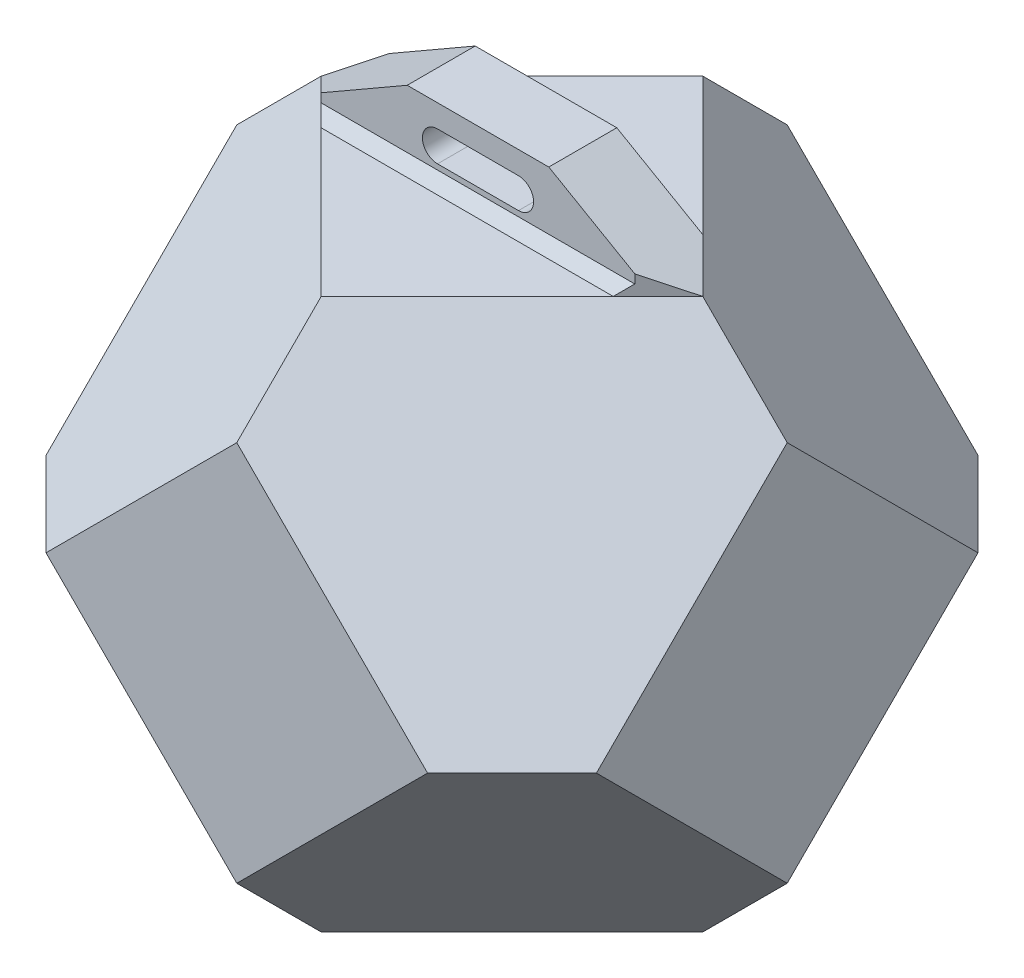
ISO-10303-21;
HEADER;
FILE_DESCRIPTION(('STEP AP214'),'2;1');
FILE_NAME('part.step','',(''),(''),'','','');
FILE_SCHEMA(('AUTOMOTIVE_DESIGN { 1 0 10303 214 1 1 1 1 }'));
ENDSEC;
DATA;
#1=APPLICATION_CONTEXT('core data for automotive mechanical design processes');
#2=APPLICATION_PROTOCOL_DEFINITION('international standard','automotive_design',2000,#1);
#3=PRODUCT_CONTEXT('',#1,'mechanical');
#4=PRODUCT('Part','Part','',(#3));
#5=PRODUCT_RELATED_PRODUCT_CATEGORY('part','',(#4));
#6=PRODUCT_DEFINITION_FORMATION('','',#4);
#7=PRODUCT_DEFINITION_CONTEXT('part definition',#1,'design');
#8=PRODUCT_DEFINITION('design','',#6,#7);
#9=PRODUCT_DEFINITION_SHAPE('','',#8);
#10=(LENGTH_UNIT() NAMED_UNIT(*) SI_UNIT(.MILLI.,.METRE.));
#11=(NAMED_UNIT(*) PLANE_ANGLE_UNIT() SI_UNIT($,.RADIAN.));
#12=(NAMED_UNIT(*) SI_UNIT($,.STERADIAN.) SOLID_ANGLE_UNIT());
#13=UNCERTAINTY_MEASURE_WITH_UNIT(LENGTH_MEASURE(1.E-05),#10,'distance_accuracy_value','');
#14=(GEOMETRIC_REPRESENTATION_CONTEXT(3) GLOBAL_UNCERTAINTY_ASSIGNED_CONTEXT((#13)) GLOBAL_UNIT_ASSIGNED_CONTEXT((#10,
#11,#12)) REPRESENTATION_CONTEXT('',''));
#15=CARTESIAN_POINT('',(0.,0.,0.));
#16=DIRECTION('',(0.,0.,1.));
#17=DIRECTION('',(1.,0.,0.));
#18=AXIS2_PLACEMENT_3D('',#15,#16,#17);
#19=CARTESIAN_POINT('',(14.5276695296637,31.9,3.15));
#20=DIRECTION('',(0.,0.,-1.));
#21=DIRECTION('',(-1.,0.,0.));
#22=AXIS2_PLACEMENT_3D('',#19,#20,#21);
#23=PLANE('',#22);
#24=DIRECTION('',(-1.,0.,0.));
#25=VECTOR('',#24,1.);
#26=CARTESIAN_POINT('',(14.5276695296637,27.,3.15));
#27=LINE('',#26,#25);
#28=CARTESIAN_POINT('',(3.75,27.,3.15));
#29=VERTEX_POINT('',#28);
#30=CARTESIAN_POINT('',(-3.75,27.,3.15));
#31=VERTEX_POINT('',#30);
#32=EDGE_CURVE('E199',#29,#31,#27,.T.);
#33=ORIENTED_EDGE('',*,*,#32,.T.);
#34=CARTESIAN_POINT('',(-3.75,28.4,3.15));
#35=DIRECTION('',(0.,0.,-1.));
#36=DIRECTION('',(-1.,0.,0.));
#37=AXIS2_PLACEMENT_3D('',#34,#35,#36);
#38=CIRCLE('',#37,1.4);
#39=CARTESIAN_POINT('',(-3.75,29.8,3.15));
#40=VERTEX_POINT('',#39);
#41=EDGE_CURVE('E220',#31,#40,#38,.T.);
#42=ORIENTED_EDGE('',*,*,#41,.T.);
#43=DIRECTION('',(1.,0.,0.));
#44=VECTOR('',#43,1.);
#45=CARTESIAN_POINT('',(14.5276695296637,29.8,3.15));
#46=LINE('',#45,#44);
#47=CARTESIAN_POINT('',(3.75,29.8,3.15));
#48=VERTEX_POINT('',#47);
#49=EDGE_CURVE('E218',#40,#48,#46,.T.);
#50=ORIENTED_EDGE('',*,*,#49,.T.);
#51=CARTESIAN_POINT('',(3.75,28.4,3.15));
#52=DIRECTION('',(0.,0.,-1.));
#53=DIRECTION('',(-1.,0.,0.));
#54=AXIS2_PLACEMENT_3D('',#51,#52,#53);
#55=CIRCLE('',#54,1.4);
#56=EDGE_CURVE('E204',#48,#29,#55,.T.);
#57=ORIENTED_EDGE('',*,*,#56,.T.);
#58=EDGE_LOOP('',(#33,#42,#50,#57));
#59=FACE_BOUND('',#58,.T.);
#60=DIRECTION('',(0.866658942085123,-0.498901070457756,0.));
#61=VECTOR('',#60,1.);
#62=CARTESIAN_POINT('',(12.5444984325514,28.4549623627383,3.15));
#63=LINE('',#62,#61);
#64=CARTESIAN_POINT('',(6.56,31.9,3.15));
#65=VERTEX_POINT('',#64);
#66=CARTESIAN_POINT('',(14.5276695296637,27.3133296682556,3.15));
#67=VERTEX_POINT('',#66);
#68=EDGE_CURVE('E231',#65,#67,#63,.T.);
#69=ORIENTED_EDGE('',*,*,#68,.F.);
#70=DIRECTION('',(1.,0.,0.));
#71=VECTOR('',#70,1.);
#72=CARTESIAN_POINT('',(14.5276695296637,31.9,3.15));
#73=LINE('',#72,#71);
#74=CARTESIAN_POINT('',(-6.56,31.9,3.15));
#75=VERTEX_POINT('',#74);
#76=EDGE_CURVE('E245',#75,#65,#73,.T.);
#77=ORIENTED_EDGE('',*,*,#76,.F.);
#78=DIRECTION('',(-0.866658942085123,-0.498901070457756,0.));
#79=VECTOR('',#78,1.);
#80=CARTESIAN_POINT('',(9.2789005438283,41.0178248471978,3.15));
#81=LINE('',#80,#79);
#82=CARTESIAN_POINT('',(-14.5276695296637,27.3133296682556,3.15));
#83=VERTEX_POINT('',#82);
#84=EDGE_CURVE('E242',#75,#83,#81,.T.);
#85=ORIENTED_EDGE('',*,*,#84,.T.);
#86=DIRECTION('',(0.,-1.,0.));
#87=VECTOR('',#86,1.);
#88=CARTESIAN_POINT('',(-14.5276695296637,31.9,3.15));
#89=LINE('',#88,#87);
#90=CARTESIAN_POINT('',(-14.5276695296637,26.5,3.15));
#91=VERTEX_POINT('',#90);
#92=EDGE_CURVE('E256',#83,#91,#89,.T.);
#93=ORIENTED_EDGE('',*,*,#92,.T.);
#94=DIRECTION('',(1.,0.,0.));
#95=VECTOR('',#94,1.);
#96=CARTESIAN_POINT('',(14.5276695296637,26.5,3.15));
#97=LINE('',#96,#95);
#98=CARTESIAN_POINT('',(14.5276695296637,26.5,3.15));
#99=VERTEX_POINT('',#98);
#100=EDGE_CURVE('E272',#91,#99,#97,.T.);
#101=ORIENTED_EDGE('',*,*,#100,.T.);
#102=DIRECTION('',(0.,-1.,0.));
#103=VECTOR('',#102,1.);
#104=CARTESIAN_POINT('',(14.5276695296637,31.9,3.15));
#105=LINE('',#104,#103);
#106=EDGE_CURVE('E254',#67,#99,#105,.T.);
#107=ORIENTED_EDGE('',*,*,#106,.F.);
#108=EDGE_LOOP('',(#69,#77,#85,#93,#101,#107));
#109=FACE_BOUND('',#108,.T.);
#110=ADVANCED_FACE('F41',(#59,#109),#23,.F.);
#111=CARTESIAN_POINT('',(17.6776695296637,31.9,0.));
#112=DIRECTION('',(-0.707106781186548,0.,-0.707106781186547));
#113=DIRECTION('',(-0.707106781186547,0.,0.707106781186548));
#114=AXIS2_PLACEMENT_3D('',#111,#112,#113);
#115=PLANE('',#114);
#116=DIRECTION('',(0.654927204868428,-0.377015533693844,-0.654927204868429));
#117=VECTOR('',#116,1.);
#118=CARTESIAN_POINT('',(16.0973960597495,26.4097005609373,1.58027346991415));
#119=LINE('',#118,#117);
#120=CARTESIAN_POINT('',(17.6776695296637,25.5,0.));
#121=VERTEX_POINT('',#120);
#122=EDGE_CURVE('E229',#67,#121,#119,.T.);
#123=ORIENTED_EDGE('',*,*,#122,.F.);
#124=ORIENTED_EDGE('',*,*,#106,.T.);
#125=DIRECTION('',(-0.577350269189623,-0.577350269189631,0.577350269189623));
#126=VECTOR('',#125,1.);
#127=CARTESIAN_POINT('',(18.4276695296637,30.4000000000001,-0.749999999999997));
#128=LINE('',#127,#126);
#129=CARTESIAN_POINT('',(13.5276695296637,25.5,4.15));
#130=VERTEX_POINT('',#129);
#131=EDGE_CURVE('E402',#99,#130,#128,.T.);
#132=ORIENTED_EDGE('',*,*,#131,.T.);
#133=DIRECTION('',(-0.707106781186547,0.,0.707106781186548));
#134=VECTOR('',#133,1.);
#135=CARTESIAN_POINT('',(0.,25.5,17.6776695296637));
#136=LINE('',#135,#134);
#137=EDGE_CURVE('E277',#121,#130,#136,.T.);
#138=ORIENTED_EDGE('',*,*,#137,.F.);
#139=EDGE_LOOP('',(#123,#124,#132,#138));
#140=FACE_BOUND('',#139,.T.);
#141=ADVANCED_FACE('F439',(#140),#115,.F.);
#142=CARTESIAN_POINT('',(14.5276695296637,31.9,-3.15));
#143=DIRECTION('',(-0.707106781186544,0.,0.707106781186551));
#144=DIRECTION('',(0.707106781186551,0.,0.707106781186544));
#145=AXIS2_PLACEMENT_3D('',#142,#143,#144);
#146=PLANE('',#145);
#147=DIRECTION('',(-0.654927204868432,0.377015533693846,-0.654927204868425));
#148=VECTOR('',#147,1.);
#149=CARTESIAN_POINT('',(13.3951393045858,27.9652822578841,-4.28253022507784));
#150=LINE('',#149,#148);
#151=CARTESIAN_POINT('',(14.5276695296637,27.3133296682556,-3.15));
#152=VERTEX_POINT('',#151);
#153=EDGE_CURVE('E227',#121,#152,#150,.T.);
#154=ORIENTED_EDGE('',*,*,#153,.F.);
#155=DIRECTION('',(-0.707106781186547,0.,-0.707106781186548));
#156=VECTOR('',#155,1.);
#157=CARTESIAN_POINT('',(0.,25.5,-17.6776695296637));
#158=LINE('',#157,#156);
#159=CARTESIAN_POINT('',(13.5276695296637,25.5,-4.15));
#160=VERTEX_POINT('',#159);
#161=EDGE_CURVE('E317',#121,#160,#158,.T.);
#162=ORIENTED_EDGE('',*,*,#161,.T.);
#163=DIRECTION('',(0.577350269189627,0.577350269189629,0.577350269189621));
#164=VECTOR('',#163,1.);
#165=CARTESIAN_POINT('',(16.3276695296637,28.3,-1.35000000000001));
#166=LINE('',#165,#164);
#167=CARTESIAN_POINT('',(14.5276695296637,26.5,-3.15));
#168=VERTEX_POINT('',#167);
#169=EDGE_CURVE('E407',#160,#168,#166,.T.);
#170=ORIENTED_EDGE('',*,*,#169,.T.);
#171=DIRECTION('',(0.,-1.,0.));
#172=VECTOR('',#171,1.);
#173=CARTESIAN_POINT('',(14.5276695296637,31.9,-3.15));
#174=LINE('',#173,#172);
#175=EDGE_CURVE('E252',#152,#168,#174,.T.);
#176=ORIENTED_EDGE('',*,*,#175,.F.);
#177=EDGE_LOOP('',(#154,#162,#170,#176));
#178=FACE_BOUND('',#177,.T.);
#179=ADVANCED_FACE('F446',(#178),#146,.F.);
#180=CARTESIAN_POINT('',(-14.5276695296637,31.9,-3.15));
#181=DIRECTION('',(0.,0.,1.));
#182=DIRECTION('',(1.,0.,0.));
#183=AXIS2_PLACEMENT_3D('',#180,#181,#182);
#184=PLANE('',#183);
#185=DIRECTION('',(-1.,0.,0.));
#186=VECTOR('',#185,1.);
#187=CARTESIAN_POINT('',(-14.5276695296637,29.8,-3.15));
#188=LINE('',#187,#186);
#189=CARTESIAN_POINT('',(3.75,29.8,-3.15));
#190=VERTEX_POINT('',#189);
#191=CARTESIAN_POINT('',(-3.75,29.8,-3.15));
#192=VERTEX_POINT('',#191);
#193=EDGE_CURVE('E49',#190,#192,#188,.T.);
#194=ORIENTED_EDGE('',*,*,#193,.T.);
#195=CARTESIAN_POINT('',(-3.75,28.4,-3.15));
#196=DIRECTION('',(0.,0.,1.));
#197=DIRECTION('',(1.,0.,0.));
#198=AXIS2_PLACEMENT_3D('',#195,#196,#197);
#199=CIRCLE('',#198,1.4);
#200=CARTESIAN_POINT('',(-3.75,27.,-3.15));
#201=VERTEX_POINT('',#200);
#202=EDGE_CURVE('E12',#192,#201,#199,.T.);
#203=ORIENTED_EDGE('',*,*,#202,.T.);
#204=DIRECTION('',(1.,0.,0.));
#205=VECTOR('',#204,1.);
#206=CARTESIAN_POINT('',(-14.5276695296637,27.,-3.15));
#207=LINE('',#206,#205);
#208=CARTESIAN_POINT('',(3.75,27.,-3.15));
#209=VERTEX_POINT('',#208);
#210=EDGE_CURVE('E412',#201,#209,#207,.T.);
#211=ORIENTED_EDGE('',*,*,#210,.T.);
#212=CARTESIAN_POINT('',(3.75,28.4,-3.15));
#213=DIRECTION('',(0.,0.,1.));
#214=DIRECTION('',(1.,0.,0.));
#215=AXIS2_PLACEMENT_3D('',#212,#213,#214);
#216=CIRCLE('',#215,1.4);
#217=EDGE_CURVE('E212',#209,#190,#216,.T.);
#218=ORIENTED_EDGE('',*,*,#217,.T.);
#219=EDGE_LOOP('',(#194,#203,#211,#218));
#220=FACE_BOUND('',#219,.T.);
#221=DIRECTION('',(-0.866658942085123,0.498901070457756,0.));
#222=VECTOR('',#221,1.);
#223=CARTESIAN_POINT('',(-9.27890054382829,41.0178248471978,-3.15));
#224=LINE('',#223,#222);
#225=CARTESIAN_POINT('',(6.56,31.9,-3.15));
#226=VERTEX_POINT('',#225);
#227=EDGE_CURVE('E225',#152,#226,#224,.T.);
#228=ORIENTED_EDGE('',*,*,#227,.F.);
#229=ORIENTED_EDGE('',*,*,#175,.T.);
#230=DIRECTION('',(-1.,0.,0.));
#231=VECTOR('',#230,1.);
#232=CARTESIAN_POINT('',(-14.5276695296637,26.5,-3.15));
#233=LINE('',#232,#231);
#234=CARTESIAN_POINT('',(-14.5276695296637,26.5,-3.15));
#235=VERTEX_POINT('',#234);
#236=EDGE_CURVE('E324',#168,#235,#233,.T.);
#237=ORIENTED_EDGE('',*,*,#236,.T.);
#238=DIRECTION('',(0.,-1.,0.));
#239=VECTOR('',#238,1.);
#240=CARTESIAN_POINT('',(-14.5276695296637,31.9,-3.15));
#241=LINE('',#240,#239);
#242=CARTESIAN_POINT('',(-14.5276695296637,27.3133296682556,-3.15));
#243=VERTEX_POINT('',#242);
#244=EDGE_CURVE('E250',#243,#235,#241,.T.);
#245=ORIENTED_EDGE('',*,*,#244,.F.);
#246=DIRECTION('',(0.866658942085123,0.498901070457756,0.));
#247=VECTOR('',#246,1.);
#248=CARTESIAN_POINT('',(-12.5444984325514,28.4549623627383,-3.15));
#249=LINE('',#248,#247);
#250=CARTESIAN_POINT('',(-6.56,31.9,-3.15));
#251=VERTEX_POINT('',#250);
#252=EDGE_CURVE('E236',#243,#251,#249,.T.);
#253=ORIENTED_EDGE('',*,*,#252,.T.);
#254=DIRECTION('',(-1.,0.,0.));
#255=VECTOR('',#254,1.);
#256=CARTESIAN_POINT('',(-14.5276695296637,31.9,-3.15));
#257=LINE('',#256,#255);
#258=EDGE_CURVE('E248',#226,#251,#257,.T.);
#259=ORIENTED_EDGE('',*,*,#258,.F.);
#260=EDGE_LOOP('',(#228,#229,#237,#245,#253,#259));
#261=FACE_BOUND('',#260,.T.);
#262=ADVANCED_FACE('F416',(#220,#261),#184,.F.);
#263=CARTESIAN_POINT('',(0.,31.9,0.));
#264=DIRECTION('',(0.,-1.,0.));
#265=DIRECTION('',(0.,0.,-1.));
#266=AXIS2_PLACEMENT_3D('',#263,#264,#265);
#267=PLANE('',#266);
#268=DIRECTION('',(0.,0.,1.));
#269=VECTOR('',#268,1.);
#270=CARTESIAN_POINT('',(6.56,31.9,0.));
#271=LINE('',#270,#269);
#272=EDGE_CURVE('E405',#226,#65,#271,.T.);
#273=ORIENTED_EDGE('',*,*,#272,.F.);
#274=ORIENTED_EDGE('',*,*,#258,.T.);
#275=DIRECTION('',(0.,0.,1.));
#276=VECTOR('',#275,1.);
#277=CARTESIAN_POINT('',(-6.56,31.9,0.));
#278=LINE('',#277,#276);
#279=EDGE_CURVE('E401',#251,#75,#278,.T.);
#280=ORIENTED_EDGE('',*,*,#279,.T.);
#281=ORIENTED_EDGE('',*,*,#76,.T.);
#282=EDGE_LOOP('',(#273,#274,#280,#281));
#283=FACE_BOUND('',#282,.T.);
#284=ADVANCED_FACE('F537',(#283),#267,.F.);
#285=CARTESIAN_POINT('',(0.,25.5,0.));
#286=DIRECTION('',(0.,1.,0.));
#287=DIRECTION('',(0.,0.,1.));
#288=AXIS2_PLACEMENT_3D('',#285,#286,#287);
#289=PLANE('',#288);
#290=DIRECTION('',(0.707106781186547,0.,-0.707106781186548));
#291=VECTOR('',#290,1.);
#292=CARTESIAN_POINT('',(0.,25.5,-17.6776695296637));
#293=LINE('',#292,#291);
#294=CARTESIAN_POINT('',(-13.5276695296637,25.5,-4.15));
#295=VERTEX_POINT('',#294);
#296=CARTESIAN_POINT('',(0.,25.5,-17.6776695296637));
#297=VERTEX_POINT('',#296);
#298=EDGE_CURVE('E326',#295,#297,#293,.T.);
#299=ORIENTED_EDGE('',*,*,#298,.F.);
#300=DIRECTION('',(1.,0.,0.));
#301=VECTOR('',#300,1.);
#302=CARTESIAN_POINT('',(0.,25.5,-4.15));
#303=LINE('',#302,#301);
#304=EDGE_CURVE('E330',#295,#160,#303,.T.);
#305=ORIENTED_EDGE('',*,*,#304,.T.);
#306=EDGE_CURVE('E309',#160,#297,#158,.T.);
#307=ORIENTED_EDGE('',*,*,#306,.T.);
#308=EDGE_LOOP('',(#299,#305,#307));
#309=FACE_BOUND('',#308,.T.);
#310=ADVANCED_FACE('F491',(#309),#289,.T.);
#311=CARTESIAN_POINT('',(-25.5,25.5,25.5));
#312=DIRECTION('',(0.,0.,-1.));
#313=DIRECTION('',(-1.,0.,0.));
#314=AXIS2_PLACEMENT_3D('',#311,#312,#313);
#315=PLANE('',#314);
#316=DIRECTION('',(-0.707106781186547,-0.707106781186548,0.));
#317=VECTOR('',#316,1.);
#318=CARTESIAN_POINT('',(7.82233047033629,25.5,25.5));
#319=LINE('',#318,#317);
#320=CARTESIAN_POINT('',(0.,17.6776695296637,25.5));
#321=VERTEX_POINT('',#320);
#322=CARTESIAN_POINT('',(-17.6776695296637,0.,25.5));
#323=VERTEX_POINT('',#322);
#324=EDGE_CURVE('E371',#321,#323,#319,.T.);
#325=ORIENTED_EDGE('',*,*,#324,.T.);
#326=DIRECTION('',(-0.707106781186547,0.707106781186548,0.));
#327=VECTOR('',#326,1.);
#328=CARTESIAN_POINT('',(7.82233047033629,-25.5,25.5));
#329=LINE('',#328,#327);
#330=CARTESIAN_POINT('',(0.,-17.6776695296637,25.5));
#331=VERTEX_POINT('',#330);
#332=EDGE_CURVE('E350',#331,#323,#329,.T.);
#333=ORIENTED_EDGE('',*,*,#332,.F.);
#334=DIRECTION('',(0.707106781186547,0.707106781186548,0.));
#335=VECTOR('',#334,1.);
#336=CARTESIAN_POINT('',(-7.82233047033629,-25.5,25.5));
#337=LINE('',#336,#335);
#338=CARTESIAN_POINT('',(17.6776695296637,0.,25.5));
#339=VERTEX_POINT('',#338);
#340=EDGE_CURVE('E304',#331,#339,#337,.T.);
#341=ORIENTED_EDGE('',*,*,#340,.T.);
#342=DIRECTION('',(0.707106781186547,-0.707106781186548,0.));
#343=VECTOR('',#342,1.);
#344=CARTESIAN_POINT('',(-7.82233047033629,25.5,25.5));
#345=LINE('',#344,#343);
#346=EDGE_CURVE('E278',#321,#339,#345,.T.);
#347=ORIENTED_EDGE('',*,*,#346,.F.);
#348=EDGE_LOOP('',(#325,#333,#341,#347));
#349=FACE_BOUND('',#348,.T.);
#350=ADVANCED_FACE('F490',(#349),#315,.F.);
#351=CARTESIAN_POINT('',(0.,25.5,17.6776695296637));
#352=VERTEX_POINT('',#351);
#353=EDGE_CURVE('E274',#130,#352,#136,.T.);
#354=ORIENTED_EDGE('',*,*,#353,.F.);
#355=DIRECTION('',(-1.,0.,0.));
#356=VECTOR('',#355,1.);
#357=CARTESIAN_POINT('',(0.,25.5,4.15));
#358=LINE('',#357,#356);
#359=CARTESIAN_POINT('',(-13.5276695296637,25.5,4.15));
#360=VERTEX_POINT('',#359);
#361=EDGE_CURVE('E279',#130,#360,#358,.T.);
#362=ORIENTED_EDGE('',*,*,#361,.T.);
#363=DIRECTION('',(0.707106781186547,0.,0.707106781186548));
#364=VECTOR('',#363,1.);
#365=CARTESIAN_POINT('',(0.,25.5,17.6776695296637));
#366=LINE('',#365,#364);
#367=EDGE_CURVE('E258',#360,#352,#366,.T.);
#368=ORIENTED_EDGE('',*,*,#367,.T.);
#369=EDGE_LOOP('',(#354,#362,#368));
#370=FACE_BOUND('',#369,.T.);
#371=ADVANCED_FACE('F394',(#370),#289,.T.);
#372=CARTESIAN_POINT('',(-25.5,25.5,-25.5));
#373=DIRECTION('',(1.,0.,0.));
#374=DIRECTION('',(0.,0.,-1.));
#375=AXIS2_PLACEMENT_3D('',#372,#373,#374);
#376=PLANE('',#375);
#377=DIRECTION('',(0.,0.707106781186547,-0.707106781186548));
#378=VECTOR('',#377,1.);
#379=CARTESIAN_POINT('',(-25.5,-7.82233047033631,25.5));
#380=LINE('',#379,#378);
#381=CARTESIAN_POINT('',(-25.5,0.,17.6776695296637));
#382=VERTEX_POINT('',#381);
#383=CARTESIAN_POINT('',(-25.5,17.6776695296637,0.));
#384=VERTEX_POINT('',#383);
#385=EDGE_CURVE('E366',#382,#384,#380,.T.);
#386=ORIENTED_EDGE('',*,*,#385,.T.);
#387=DIRECTION('',(0.,0.707106781186547,0.707106781186548));
#388=VECTOR('',#387,1.);
#389=CARTESIAN_POINT('',(-25.5,-7.82233047033631,-25.5));
#390=LINE('',#389,#388);
#391=CARTESIAN_POINT('',(-25.5,0.,-17.6776695296637));
#392=VERTEX_POINT('',#391);
#393=EDGE_CURVE('E596',#392,#384,#390,.T.);
#394=ORIENTED_EDGE('',*,*,#393,.F.);
#395=DIRECTION('',(0.,-0.707106781186547,0.707106781186548));
#396=VECTOR('',#395,1.);
#397=CARTESIAN_POINT('',(-25.5,7.82233047033631,-25.5));
#398=LINE('',#397,#396);
#399=CARTESIAN_POINT('',(-25.5,-17.6776695296637,0.));
#400=VERTEX_POINT('',#399);
#401=EDGE_CURVE('E334',#392,#400,#398,.T.);
#402=ORIENTED_EDGE('',*,*,#401,.T.);
#403=DIRECTION('',(0.,-0.707106781186547,-0.707106781186548));
#404=VECTOR('',#403,1.);
#405=CARTESIAN_POINT('',(-25.5,7.82233047033631,25.5));
#406=LINE('',#405,#404);
#407=EDGE_CURVE('E347',#382,#400,#406,.T.);
#408=ORIENTED_EDGE('',*,*,#407,.F.);
#409=EDGE_LOOP('',(#386,#394,#402,#408));
#410=FACE_BOUND('',#409,.T.);
#411=ADVANCED_FACE('F473',(#410),#376,.F.);
#412=CARTESIAN_POINT('',(14.3925565098879,14.3925565098879,-14.3925565098879));
#413=DIRECTION('',(0.577350269189626,0.577350269189625,-0.577350269189626));
#414=DIRECTION('',(-0.707106781186547,0.,-0.707106781186548));
#415=AXIS2_PLACEMENT_3D('',#412,#413,#414);
#416=PLANE('',#415);
#417=ORIENTED_EDGE('',*,*,#161,.F.);
#418=DIRECTION('',(0.707106781186547,-0.707106781186548,0.));
#419=VECTOR('',#418,1.);
#420=CARTESIAN_POINT('',(21.5888347648319,21.5888347648318,0.));
#421=LINE('',#420,#419);
#422=CARTESIAN_POINT('',(25.5,17.6776695296637,0.));
#423=VERTEX_POINT('',#422);
#424=EDGE_CURVE('E292',#121,#423,#421,.T.);
#425=ORIENTED_EDGE('',*,*,#424,.T.);
#426=DIRECTION('',(0.,0.707106781186547,0.707106781186548));
#427=VECTOR('',#426,1.);
#428=CARTESIAN_POINT('',(25.5,-7.82233047033631,-25.5));
#429=LINE('',#428,#427);
#430=CARTESIAN_POINT('',(25.5,0.,-17.6776695296637));
#431=VERTEX_POINT('',#430);
#432=EDGE_CURVE('E549',#431,#423,#429,.T.);
#433=ORIENTED_EDGE('',*,*,#432,.F.);
#434=DIRECTION('',(0.707106781186547,0.,0.707106781186548));
#435=VECTOR('',#434,1.);
#436=CARTESIAN_POINT('',(21.5888347648319,0.,-21.5888347648318));
#437=LINE('',#436,#435);
#438=CARTESIAN_POINT('',(17.6776695296637,0.,-25.5));
#439=VERTEX_POINT('',#438);
#440=EDGE_CURVE('E573',#439,#431,#437,.T.);
#441=ORIENTED_EDGE('',*,*,#440,.F.);
#442=DIRECTION('',(0.707106781186547,-0.707106781186548,0.));
#443=VECTOR('',#442,1.);
#444=CARTESIAN_POINT('',(-7.82233047033629,25.5,-25.5));
#445=LINE('',#444,#443);
#446=CARTESIAN_POINT('',(0.,17.6776695296637,-25.5));
#447=VERTEX_POINT('',#446);
#448=EDGE_CURVE('E546',#447,#439,#445,.T.);
#449=ORIENTED_EDGE('',*,*,#448,.F.);
#450=DIRECTION('',(0.,0.707106781186547,0.707106781186548));
#451=VECTOR('',#450,1.);
#452=CARTESIAN_POINT('',(0.,21.5888347648319,-21.5888347648319));
#453=LINE('',#452,#451);
#454=EDGE_CURVE('E554',#447,#297,#453,.T.);
#455=ORIENTED_EDGE('',*,*,#454,.T.);
#456=ORIENTED_EDGE('',*,*,#306,.F.);
#457=EDGE_LOOP('',(#417,#425,#433,#441,#449,#455,#456));
#458=FACE_BOUND('',#457,.T.);
#459=ADVANCED_FACE('F469',(#458),#416,.T.);
#460=CARTESIAN_POINT('',(14.3925565098879,-14.3925565098879,14.3925565098879));
#461=DIRECTION('',(0.577350269189626,-0.577350269189626,0.577350269189626));
#462=DIRECTION('',(0.,-0.707106781186548,-0.707106781186548));
#463=AXIS2_PLACEMENT_3D('',#460,#461,#462);
#464=PLANE('',#463);
#465=DIRECTION('',(0.,0.707106781186548,0.707106781186548));
#466=VECTOR('',#465,1.);
#467=CARTESIAN_POINT('',(0.,-21.5888347648319,21.5888347648319));
#468=LINE('',#467,#466);
#469=CARTESIAN_POINT('',(0.,-25.5,17.6776695296637));
#470=VERTEX_POINT('',#469);
#471=EDGE_CURVE('E284',#470,#331,#468,.T.);
#472=ORIENTED_EDGE('',*,*,#471,.F.);
#473=DIRECTION('',(-0.707106781186547,0.,0.707106781186548));
#474=VECTOR('',#473,1.);
#475=CARTESIAN_POINT('',(0.,-25.5,17.6776695296637));
#476=LINE('',#475,#474);
#477=CARTESIAN_POINT('',(17.6776695296637,-25.5,0.));
#478=VERTEX_POINT('',#477);
#479=EDGE_CURVE('E296',#478,#470,#476,.T.);
#480=ORIENTED_EDGE('',*,*,#479,.F.);
#481=DIRECTION('',(-0.707106781186548,-0.707106781186547,0.));
#482=VECTOR('',#481,1.);
#483=CARTESIAN_POINT('',(21.5888347648318,-21.5888347648318,0.));
#484=LINE('',#483,#482);
#485=CARTESIAN_POINT('',(25.5,-17.6776695296637,0.));
#486=VERTEX_POINT('',#485);
#487=EDGE_CURVE('E306',#486,#478,#484,.T.);
#488=ORIENTED_EDGE('',*,*,#487,.F.);
#489=DIRECTION('',(0.,-0.707106781186547,-0.707106781186548));
#490=VECTOR('',#489,1.);
#491=CARTESIAN_POINT('',(25.5,7.82233047033631,25.5));
#492=LINE('',#491,#490);
#493=CARTESIAN_POINT('',(25.5,0.,17.6776695296637));
#494=VERTEX_POINT('',#493);
#495=EDGE_CURVE('E310',#494,#486,#492,.T.);
#496=ORIENTED_EDGE('',*,*,#495,.F.);
#497=DIRECTION('',(-0.707106781186547,0.,0.707106781186548));
#498=VECTOR('',#497,1.);
#499=CARTESIAN_POINT('',(21.5888347648319,0.,21.5888347648318));
#500=LINE('',#499,#498);
#501=EDGE_CURVE('E346',#494,#339,#500,.T.);
#502=ORIENTED_EDGE('',*,*,#501,.T.);
#503=ORIENTED_EDGE('',*,*,#340,.F.);
#504=EDGE_LOOP('',(#472,#480,#488,#496,#502,#503));
#505=FACE_BOUND('',#504,.T.);
#506=ADVANCED_FACE('F465',(#505),#464,.T.);
#507=CARTESIAN_POINT('',(25.5,25.5,-25.5));
#508=DIRECTION('',(-1.,0.,0.));
#509=DIRECTION('',(0.,0.,1.));
#510=AXIS2_PLACEMENT_3D('',#507,#508,#509);
#511=PLANE('',#510);
#512=ORIENTED_EDGE('',*,*,#432,.T.);
#513=DIRECTION('',(0.,0.707106781186547,-0.707106781186548));
#514=VECTOR('',#513,1.);
#515=CARTESIAN_POINT('',(25.5,-7.82233047033631,25.5));
#516=LINE('',#515,#514);
#517=EDGE_CURVE('E293',#494,#423,#516,.T.);
#518=ORIENTED_EDGE('',*,*,#517,.F.);
#519=ORIENTED_EDGE('',*,*,#495,.T.);
#520=DIRECTION('',(0.,-0.707106781186547,0.707106781186548));
#521=VECTOR('',#520,1.);
#522=CARTESIAN_POINT('',(25.5,7.82233047033631,-25.5));
#523=LINE('',#522,#521);
#524=EDGE_CURVE('E559',#431,#486,#523,.T.);
#525=ORIENTED_EDGE('',*,*,#524,.F.);
#526=EDGE_LOOP('',(#512,#518,#519,#525));
#527=FACE_BOUND('',#526,.T.);
#528=ADVANCED_FACE('F468',(#527),#511,.F.);
#529=CARTESIAN_POINT('',(14.3925565098879,-14.3925565098879,-14.3925565098879));
#530=DIRECTION('',(0.577350269189626,-0.577350269189626,-0.577350269189625));
#531=DIRECTION('',(0.707106781186548,0.707106781186547,0.));
#532=AXIS2_PLACEMENT_3D('',#529,#530,#531);
#533=PLANE('',#532);
#534=ORIENTED_EDGE('',*,*,#524,.T.);
#535=ORIENTED_EDGE('',*,*,#487,.T.);
#536=DIRECTION('',(-0.707106781186547,0.,-0.707106781186548));
#537=VECTOR('',#536,1.);
#538=CARTESIAN_POINT('',(0.,-25.5,-17.6776695296637));
#539=LINE('',#538,#537);
#540=CARTESIAN_POINT('',(0.,-25.5,-17.6776695296637));
#541=VERTEX_POINT('',#540);
#542=EDGE_CURVE('E565',#478,#541,#539,.T.);
#543=ORIENTED_EDGE('',*,*,#542,.T.);
#544=DIRECTION('',(0.,0.707106781186547,-0.707106781186548));
#545=VECTOR('',#544,1.);
#546=CARTESIAN_POINT('',(0.,-21.5888347648319,-21.5888347648318));
#547=LINE('',#546,#545);
#548=CARTESIAN_POINT('',(0.,-17.6776695296637,-25.5));
#549=VERTEX_POINT('',#548);
#550=EDGE_CURVE('E577',#541,#549,#547,.T.);
#551=ORIENTED_EDGE('',*,*,#550,.T.);
#552=DIRECTION('',(0.707106781186547,0.707106781186548,0.));
#553=VECTOR('',#552,1.);
#554=CARTESIAN_POINT('',(-7.82233047033629,-25.5,-25.5));
#555=LINE('',#554,#553);
#556=EDGE_CURVE('E570',#549,#439,#555,.T.);
#557=ORIENTED_EDGE('',*,*,#556,.T.);
#558=ORIENTED_EDGE('',*,*,#440,.T.);
#559=EDGE_LOOP('',(#534,#535,#543,#551,#557,#558));
#560=FACE_BOUND('',#559,.T.);
#561=ADVANCED_FACE('F475',(#560),#533,.T.);
#562=CARTESIAN_POINT('',(0.,-25.5,0.));
#563=DIRECTION('',(0.,1.,0.));
#564=DIRECTION('',(0.,0.,1.));
#565=AXIS2_PLACEMENT_3D('',#562,#563,#564);
#566=PLANE('',#565);
#567=ORIENTED_EDGE('',*,*,#479,.T.);
#568=DIRECTION('',(0.707106781186547,0.,0.707106781186548));
#569=VECTOR('',#568,1.);
#570=CARTESIAN_POINT('',(0.,-25.5,17.6776695296637));
#571=LINE('',#570,#569);
#572=CARTESIAN_POINT('',(-17.6776695296637,-25.5,0.));
#573=VERTEX_POINT('',#572);
#574=EDGE_CURVE('E359',#573,#470,#571,.T.);
#575=ORIENTED_EDGE('',*,*,#574,.F.);
#576=DIRECTION('',(0.707106781186547,0.,-0.707106781186548));
#577=VECTOR('',#576,1.);
#578=CARTESIAN_POINT('',(0.,-25.5,-17.6776695296637));
#579=LINE('',#578,#577);
#580=EDGE_CURVE('E569',#573,#541,#579,.T.);
#581=ORIENTED_EDGE('',*,*,#580,.T.);
#582=ORIENTED_EDGE('',*,*,#542,.F.);
#583=EDGE_LOOP('',(#567,#575,#581,#582));
#584=FACE_BOUND('',#583,.T.);
#585=ADVANCED_FACE('F478',(#584),#566,.F.);
#586=CARTESIAN_POINT('',(-25.5,25.5,-25.5));
#587=DIRECTION('',(0.,0.,1.));
#588=DIRECTION('',(1.,0.,0.));
#589=AXIS2_PLACEMENT_3D('',#586,#587,#588);
#590=PLANE('',#589);
#591=ORIENTED_EDGE('',*,*,#448,.T.);
#592=ORIENTED_EDGE('',*,*,#556,.F.);
#593=DIRECTION('',(-0.707106781186547,0.707106781186548,0.));
#594=VECTOR('',#593,1.);
#595=CARTESIAN_POINT('',(7.82233047033629,-25.5,-25.5));
#596=LINE('',#595,#594);
#597=CARTESIAN_POINT('',(-17.6776695296637,0.,-25.5));
#598=VERTEX_POINT('',#597);
#599=EDGE_CURVE('E588',#549,#598,#596,.T.);
#600=ORIENTED_EDGE('',*,*,#599,.T.);
#601=DIRECTION('',(-0.707106781186547,-0.707106781186548,0.));
#602=VECTOR('',#601,1.);
#603=CARTESIAN_POINT('',(7.82233047033629,25.5,-25.5));
#604=LINE('',#603,#602);
#605=EDGE_CURVE('E329',#447,#598,#604,.T.);
#606=ORIENTED_EDGE('',*,*,#605,.F.);
#607=EDGE_LOOP('',(#591,#592,#600,#606));
#608=FACE_BOUND('',#607,.T.);
#609=ADVANCED_FACE('F486',(#608),#590,.F.);
#610=CARTESIAN_POINT('',(-14.3925565098879,14.3925565098879,-14.3925565098879));
#611=DIRECTION('',(0.577350269189627,-0.577350269189626,0.577350269189625));
#612=DIRECTION('',(0.707106781186547,0.707106781186548,0.));
#613=AXIS2_PLACEMENT_3D('',#610,#611,#612);
#614=PLANE('',#613);
#615=ORIENTED_EDGE('',*,*,#393,.T.);
#616=DIRECTION('',(0.707106781186547,0.707106781186548,0.));
#617=VECTOR('',#616,1.);
#618=CARTESIAN_POINT('',(-21.5888347648318,21.5888347648318,0.));
#619=LINE('',#618,#617);
#620=CARTESIAN_POINT('',(-17.6776695296637,25.5,0.));
#621=VERTEX_POINT('',#620);
#622=EDGE_CURVE('E351',#384,#621,#619,.T.);
#623=ORIENTED_EDGE('',*,*,#622,.T.);
#624=EDGE_CURVE('E328',#621,#295,#293,.T.);
#625=ORIENTED_EDGE('',*,*,#624,.T.);
#626=ORIENTED_EDGE('',*,*,#298,.T.);
#627=ORIENTED_EDGE('',*,*,#454,.F.);
#628=ORIENTED_EDGE('',*,*,#605,.T.);
#629=DIRECTION('',(-0.707106781186547,0.,0.707106781186548));
#630=VECTOR('',#629,1.);
#631=CARTESIAN_POINT('',(-21.5888347648319,0.,-21.5888347648318));
#632=LINE('',#631,#630);
#633=EDGE_CURVE('E341',#598,#392,#632,.T.);
#634=ORIENTED_EDGE('',*,*,#633,.T.);
#635=EDGE_LOOP('',(#615,#623,#625,#626,#627,#628,#634));
#636=FACE_BOUND('',#635,.T.);
#637=ADVANCED_FACE('F482',(#636),#614,.F.);
#638=CARTESIAN_POINT('',(-14.3925565098879,-14.3925565098879,-14.3925565098879));
#639=DIRECTION('',(0.577350269189626,0.577350269189626,0.577350269189625));
#640=DIRECTION('',(-0.707106781186548,0.707106781186547,0.));
#641=AXIS2_PLACEMENT_3D('',#638,#639,#640);
#642=PLANE('',#641);
#643=ORIENTED_EDGE('',*,*,#580,.F.);
#644=DIRECTION('',(-0.707106781186548,0.707106781186547,0.));
#645=VECTOR('',#644,1.);
#646=CARTESIAN_POINT('',(-21.5888347648318,-21.5888347648318,0.));
#647=LINE('',#646,#645);
#648=EDGE_CURVE('E360',#573,#400,#647,.T.);
#649=ORIENTED_EDGE('',*,*,#648,.T.);
#650=ORIENTED_EDGE('',*,*,#401,.F.);
#651=ORIENTED_EDGE('',*,*,#633,.F.);
#652=ORIENTED_EDGE('',*,*,#599,.F.);
#653=ORIENTED_EDGE('',*,*,#550,.F.);
#654=EDGE_LOOP('',(#643,#649,#650,#651,#652,#653));
#655=FACE_BOUND('',#654,.T.);
#656=ADVANCED_FACE('F463',(#655),#642,.F.);
#657=CARTESIAN_POINT('',(14.3925565098879,14.3925565098879,14.3925565098879));
#658=DIRECTION('',(0.577350269189626,0.577350269189626,0.577350269189625));
#659=DIRECTION('',(-0.707106781186548,0.707106781186547,0.));
#660=AXIS2_PLACEMENT_3D('',#657,#658,#659);
#661=PLANE('',#660);
#662=DIRECTION('',(0.,0.707106781186547,-0.707106781186548));
#663=VECTOR('',#662,1.);
#664=CARTESIAN_POINT('',(0.,21.5888347648319,21.5888347648318));
#665=LINE('',#664,#663);
#666=EDGE_CURVE('E364',#321,#352,#665,.T.);
#667=ORIENTED_EDGE('',*,*,#666,.F.);
#668=ORIENTED_EDGE('',*,*,#346,.T.);
#669=ORIENTED_EDGE('',*,*,#501,.F.);
#670=ORIENTED_EDGE('',*,*,#517,.T.);
#671=ORIENTED_EDGE('',*,*,#424,.F.);
#672=ORIENTED_EDGE('',*,*,#137,.T.);
#673=ORIENTED_EDGE('',*,*,#353,.T.);
#674=EDGE_LOOP('',(#667,#668,#669,#670,#671,#672,#673));
#675=FACE_BOUND('',#674,.T.);
#676=ADVANCED_FACE('F459',(#675),#661,.T.);
#677=CARTESIAN_POINT('',(-14.3925565098879,-14.3925565098879,14.3925565098879));
#678=DIRECTION('',(0.577350269189626,0.577350269189626,-0.577350269189626));
#679=DIRECTION('',(-0.707106781186548,0.,-0.707106781186547));
#680=AXIS2_PLACEMENT_3D('',#677,#678,#679);
#681=PLANE('',#680);
#682=ORIENTED_EDGE('',*,*,#332,.T.);
#683=DIRECTION('',(-0.707106781186547,0.,-0.707106781186548));
#684=VECTOR('',#683,1.);
#685=CARTESIAN_POINT('',(-21.5888347648319,0.,21.5888347648318));
#686=LINE('',#685,#684);
#687=EDGE_CURVE('E343',#323,#382,#686,.T.);
#688=ORIENTED_EDGE('',*,*,#687,.T.);
#689=ORIENTED_EDGE('',*,*,#407,.T.);
#690=ORIENTED_EDGE('',*,*,#648,.F.);
#691=ORIENTED_EDGE('',*,*,#574,.T.);
#692=ORIENTED_EDGE('',*,*,#471,.T.);
#693=EDGE_LOOP('',(#682,#688,#689,#690,#691,#692));
#694=FACE_BOUND('',#693,.T.);
#695=ADVANCED_FACE('F456',(#694),#681,.F.);
#696=CARTESIAN_POINT('',(-14.3925565098879,14.3925565098879,14.3925565098879));
#697=DIRECTION('',(0.577350269189626,-0.577350269189626,-0.577350269189625));
#698=DIRECTION('',(0.707106781186547,0.707106781186548,0.));
#699=AXIS2_PLACEMENT_3D('',#696,#697,#698);
#700=PLANE('',#699);
#701=ORIENTED_EDGE('',*,*,#385,.F.);
#702=ORIENTED_EDGE('',*,*,#687,.F.);
#703=ORIENTED_EDGE('',*,*,#324,.F.);
#704=ORIENTED_EDGE('',*,*,#666,.T.);
#705=ORIENTED_EDGE('',*,*,#367,.F.);
#706=EDGE_CURVE('E265',#621,#360,#366,.T.);
#707=ORIENTED_EDGE('',*,*,#706,.F.);
#708=ORIENTED_EDGE('',*,*,#622,.F.);
#709=EDGE_LOOP('',(#701,#702,#703,#704,#705,#707,#708));
#710=FACE_BOUND('',#709,.T.);
#711=ADVANCED_FACE('F399',(#710),#700,.F.);
#712=CARTESIAN_POINT('',(-14.5276695296637,31.9,3.15));
#713=DIRECTION('',(0.707106781186547,0.,-0.707106781186548));
#714=DIRECTION('',(-0.707106781186548,0.,-0.707106781186547));
#715=AXIS2_PLACEMENT_3D('',#712,#713,#714);
#716=PLANE('',#715);
#717=ORIENTED_EDGE('',*,*,#92,.F.);
#718=DIRECTION('',(-0.654927204868429,-0.377015533693845,-0.654927204868428));
#719=VECTOR('',#718,1.);
#720=CARTESIAN_POINT('',(-13.3951393045858,27.9652822578841,4.28253022507783));
#721=LINE('',#720,#719);
#722=EDGE_CURVE('E239',#83,#621,#721,.T.);
#723=ORIENTED_EDGE('',*,*,#722,.T.);
#724=ORIENTED_EDGE('',*,*,#706,.T.);
#725=DIRECTION('',(-0.577350269189624,0.577350269189631,-0.577350269189623));
#726=VECTOR('',#725,1.);
#727=CARTESIAN_POINT('',(-16.3276695296637,28.3,1.35));
#728=LINE('',#727,#726);
#729=EDGE_CURVE('E389',#360,#91,#728,.T.);
#730=ORIENTED_EDGE('',*,*,#729,.T.);
#731=EDGE_LOOP('',(#717,#723,#724,#730));
#732=FACE_BOUND('',#731,.T.);
#733=ADVANCED_FACE('F387',(#732),#716,.F.);
#734=CARTESIAN_POINT('',(-17.6776695296637,31.9,0.));
#735=DIRECTION('',(0.707106781186548,0.,0.707106781186548));
#736=DIRECTION('',(0.707106781186548,0.,-0.707106781186548));
#737=AXIS2_PLACEMENT_3D('',#734,#735,#736);
#738=PLANE('',#737);
#739=ORIENTED_EDGE('',*,*,#624,.F.);
#740=DIRECTION('',(0.654927204868429,0.377015533693844,-0.654927204868429));
#741=VECTOR('',#740,1.);
#742=CARTESIAN_POINT('',(-16.0973960597495,26.4097005609373,-1.58027346991416));
#743=LINE('',#742,#741);
#744=EDGE_CURVE('E233',#621,#243,#743,.T.);
#745=ORIENTED_EDGE('',*,*,#744,.T.);
#746=ORIENTED_EDGE('',*,*,#244,.T.);
#747=DIRECTION('',(0.577350269189623,-0.577350269189631,-0.577350269189623));
#748=VECTOR('',#747,1.);
#749=CARTESIAN_POINT('',(-18.4276695296637,30.4000000000001,0.749999999999986));
#750=LINE('',#749,#748);
#751=EDGE_CURVE('E398',#235,#295,#750,.T.);
#752=ORIENTED_EDGE('',*,*,#751,.T.);
#753=EDGE_LOOP('',(#739,#745,#746,#752));
#754=FACE_BOUND('',#753,.T.);
#755=ADVANCED_FACE('F453',(#754),#738,.F.);
#756=CARTESIAN_POINT('',(-14.5276695296637,26.5,-3.15));
#757=DIRECTION('',(0.,-0.707106781186542,0.707106781186552));
#758=DIRECTION('',(-1.,0.,0.));
#759=AXIS2_PLACEMENT_3D('',#756,#757,#758);
#760=PLANE('',#759);
#761=ORIENTED_EDGE('',*,*,#169,.F.);
#762=ORIENTED_EDGE('',*,*,#304,.F.);
#763=ORIENTED_EDGE('',*,*,#751,.F.);
#764=ORIENTED_EDGE('',*,*,#236,.F.);
#765=EDGE_LOOP('',(#761,#762,#763,#764));
#766=FACE_BOUND('',#765,.T.);
#767=ADVANCED_FACE('F504',(#766),#760,.F.);
#768=CARTESIAN_POINT('',(14.5276695296637,26.5,3.15));
#769=DIRECTION('',(0.,-0.707106781186542,-0.707106781186552));
#770=DIRECTION('',(1.,0.,0.));
#771=AXIS2_PLACEMENT_3D('',#768,#769,#770);
#772=PLANE('',#771);
#773=ORIENTED_EDGE('',*,*,#729,.F.);
#774=ORIENTED_EDGE('',*,*,#361,.F.);
#775=ORIENTED_EDGE('',*,*,#131,.F.);
#776=ORIENTED_EDGE('',*,*,#100,.F.);
#777=EDGE_LOOP('',(#773,#774,#775,#776));
#778=FACE_BOUND('',#777,.T.);
#779=ADVANCED_FACE('F43',(#778),#772,.F.);
#780=CARTESIAN_POINT('',(-17.6776695296637,25.5,-25.5));
#781=DIRECTION('',(0.498901070457756,-0.866658942085123,0.));
#782=DIRECTION('',(0.866658942085123,0.498901070457756,0.));
#783=AXIS2_PLACEMENT_3D('',#780,#781,#782);
#784=PLANE('',#783);
#785=ORIENTED_EDGE('',*,*,#279,.F.);
#786=ORIENTED_EDGE('',*,*,#252,.F.);
#787=ORIENTED_EDGE('',*,*,#744,.F.);
#788=ORIENTED_EDGE('',*,*,#722,.F.);
#789=ORIENTED_EDGE('',*,*,#84,.F.);
#790=EDGE_LOOP('',(#785,#786,#787,#788,#789));
#791=FACE_BOUND('',#790,.T.);
#792=ADVANCED_FACE('F434',(#791),#784,.F.);
#793=CARTESIAN_POINT('',(17.6776695296637,25.5,-25.5));
#794=DIRECTION('',(0.498901070457756,0.866658942085123,0.));
#795=DIRECTION('',(-0.866658942085123,0.498901070457756,0.));
#796=AXIS2_PLACEMENT_3D('',#793,#794,#795);
#797=PLANE('',#796);
#798=ORIENTED_EDGE('',*,*,#68,.T.);
#799=ORIENTED_EDGE('',*,*,#122,.T.);
#800=ORIENTED_EDGE('',*,*,#153,.T.);
#801=ORIENTED_EDGE('',*,*,#227,.T.);
#802=ORIENTED_EDGE('',*,*,#272,.T.);
#803=EDGE_LOOP('',(#798,#799,#800,#801,#802));
#804=FACE_BOUND('',#803,.T.);
#805=ADVANCED_FACE('F427',(#804),#797,.T.);
#806=CARTESIAN_POINT('',(-3.75,28.4,-25.5));
#807=DIRECTION('',(0.,0.,1.));
#808=DIRECTION('',(1.,0.,0.));
#809=AXIS2_PLACEMENT_3D('',#806,#807,#808);
#810=CYLINDRICAL_SURFACE('',#809,1.4);
#811=DIRECTION('',(0.,0.,1.));
#812=VECTOR('',#811,1.);
#813=CARTESIAN_POINT('',(-3.75,27.,-25.5));
#814=LINE('',#813,#812);
#815=EDGE_CURVE('E56',#201,#31,#814,.T.);
#816=ORIENTED_EDGE('',*,*,#815,.F.);
#817=ORIENTED_EDGE('',*,*,#202,.F.);
#818=DIRECTION('',(0.,0.,1.));
#819=VECTOR('',#818,1.);
#820=CARTESIAN_POINT('',(-3.75,29.8,-25.5));
#821=LINE('',#820,#819);
#822=EDGE_CURVE('E205',#192,#40,#821,.T.);
#823=ORIENTED_EDGE('',*,*,#822,.T.);
#824=ORIENTED_EDGE('',*,*,#41,.F.);
#825=EDGE_LOOP('',(#816,#817,#823,#824));
#826=FACE_BOUND('',#825,.T.);
#827=ADVANCED_FACE('F425',(#826),#810,.F.);
#828=CARTESIAN_POINT('',(-3.75,29.8,-25.5));
#829=DIRECTION('',(0.,1.,0.));
#830=DIRECTION('',(0.,0.,1.));
#831=AXIS2_PLACEMENT_3D('',#828,#829,#830);
#832=PLANE('',#831);
#833=ORIENTED_EDGE('',*,*,#822,.F.);
#834=ORIENTED_EDGE('',*,*,#193,.F.);
#835=DIRECTION('',(0.,0.,1.));
#836=VECTOR('',#835,1.);
#837=CARTESIAN_POINT('',(3.75,29.8,-25.5));
#838=LINE('',#837,#836);
#839=EDGE_CURVE('E214',#190,#48,#838,.T.);
#840=ORIENTED_EDGE('',*,*,#839,.T.);
#841=ORIENTED_EDGE('',*,*,#49,.F.);
#842=EDGE_LOOP('',(#833,#834,#840,#841));
#843=FACE_BOUND('',#842,.T.);
#844=ADVANCED_FACE('F420',(#843),#832,.F.);
#845=CARTESIAN_POINT('',(3.75,28.4,-25.5));
#846=DIRECTION('',(0.,0.,1.));
#847=DIRECTION('',(1.,0.,0.));
#848=AXIS2_PLACEMENT_3D('',#845,#846,#847);
#849=CYLINDRICAL_SURFACE('',#848,1.4);
#850=ORIENTED_EDGE('',*,*,#839,.F.);
#851=ORIENTED_EDGE('',*,*,#217,.F.);
#852=DIRECTION('',(0.,0.,1.));
#853=VECTOR('',#852,1.);
#854=CARTESIAN_POINT('',(3.75,27.,-25.5));
#855=LINE('',#854,#853);
#856=EDGE_CURVE('E61',#209,#29,#855,.T.);
#857=ORIENTED_EDGE('',*,*,#856,.T.);
#858=ORIENTED_EDGE('',*,*,#56,.F.);
#859=EDGE_LOOP('',(#850,#851,#857,#858));
#860=FACE_BOUND('',#859,.T.);
#861=ADVANCED_FACE('F209',(#860),#849,.F.);
#862=CARTESIAN_POINT('',(-3.75,27.,-25.5));
#863=DIRECTION('',(0.,-1.,0.));
#864=DIRECTION('',(0.,0.,-1.));
#865=AXIS2_PLACEMENT_3D('',#862,#863,#864);
#866=PLANE('',#865);
#867=ORIENTED_EDGE('',*,*,#856,.F.);
#868=ORIENTED_EDGE('',*,*,#210,.F.);
#869=ORIENTED_EDGE('',*,*,#815,.T.);
#870=ORIENTED_EDGE('',*,*,#32,.F.);
#871=EDGE_LOOP('',(#867,#868,#869,#870));
#872=FACE_BOUND('',#871,.T.);
#873=ADVANCED_FACE('F200',(#872),#866,.F.);
#874=CLOSED_SHELL('',(#110,#141,#179,#262,#284,#310,#350,#371,#411,#459,#506,#528,#561,#585,
#609,#637,#656,#676,#695,#711,#733,#755,#767,#779,#792,#805,#827,#844,#861,#873));
#875=MANIFOLD_SOLID_BREP('B2',#874);
#876=ADVANCED_BREP_SHAPE_REPRESENTATION('',(#18,#875),#14);
#877=SHAPE_DEFINITION_REPRESENTATION(#9,#876);
ENDSEC;
END-ISO-10303-21;
